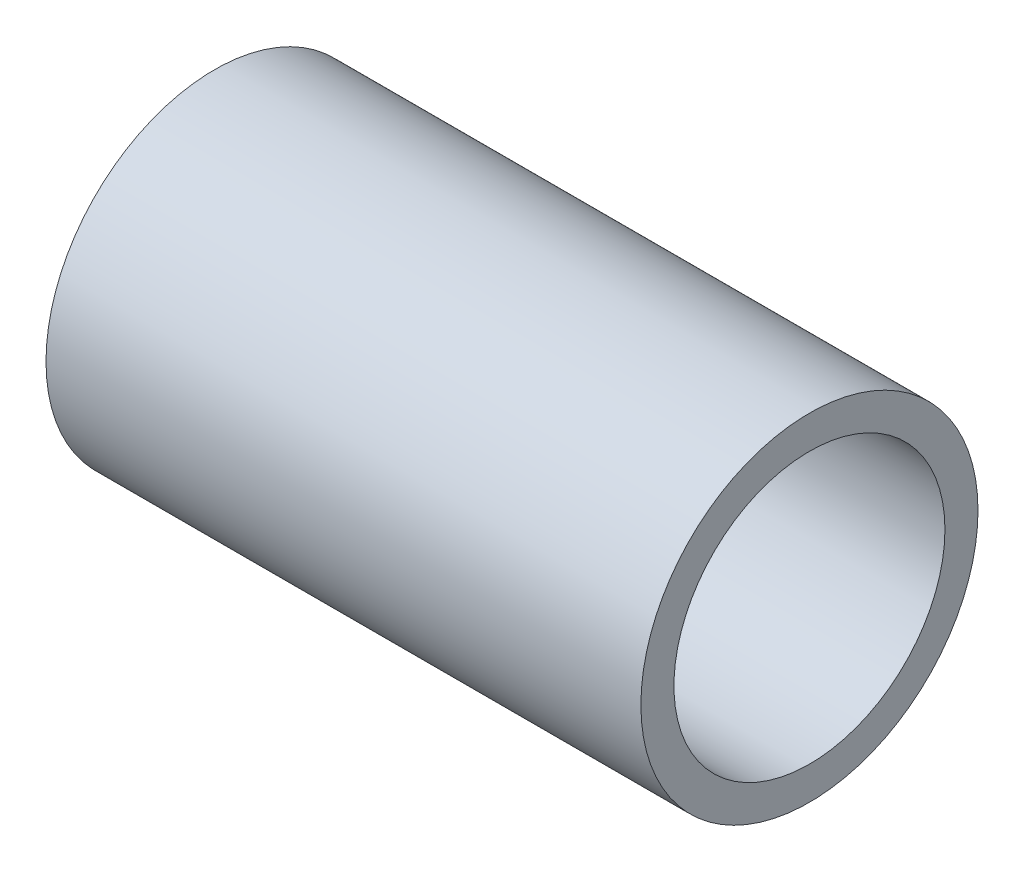
ISO-10303-21;
HEADER;
FILE_DESCRIPTION(('STEP AP214'),'2;1');
FILE_NAME('part.step','',(''),(''),'','','');
FILE_SCHEMA(('AUTOMOTIVE_DESIGN { 1 0 10303 214 1 1 1 1 }'));
ENDSEC;
DATA;
#1=APPLICATION_CONTEXT('core data for automotive mechanical design processes');
#2=APPLICATION_PROTOCOL_DEFINITION('international standard','automotive_design',2000,#1);
#3=PRODUCT_CONTEXT('',#1,'mechanical');
#4=PRODUCT('Part','Part','',(#3));
#5=PRODUCT_RELATED_PRODUCT_CATEGORY('part','',(#4));
#6=PRODUCT_DEFINITION_FORMATION('','',#4);
#7=PRODUCT_DEFINITION_CONTEXT('part definition',#1,'design');
#8=PRODUCT_DEFINITION('design','',#6,#7);
#9=PRODUCT_DEFINITION_SHAPE('','',#8);
#10=(LENGTH_UNIT() NAMED_UNIT(*) SI_UNIT(.MILLI.,.METRE.));
#11=(NAMED_UNIT(*) PLANE_ANGLE_UNIT() SI_UNIT($,.RADIAN.));
#12=(NAMED_UNIT(*) SI_UNIT($,.STERADIAN.) SOLID_ANGLE_UNIT());
#13=UNCERTAINTY_MEASURE_WITH_UNIT(LENGTH_MEASURE(1.E-05),#10,'distance_accuracy_value','');
#14=(GEOMETRIC_REPRESENTATION_CONTEXT(3) GLOBAL_UNCERTAINTY_ASSIGNED_CONTEXT((#13)) GLOBAL_UNIT_ASSIGNED_CONTEXT((#10,
#11,#12)) REPRESENTATION_CONTEXT('',''));
#15=CARTESIAN_POINT('',(0.,0.,0.));
#16=DIRECTION('',(0.,0.,1.));
#17=DIRECTION('',(1.,0.,0.));
#18=AXIS2_PLACEMENT_3D('',#15,#16,#17);
#19=CARTESIAN_POINT('',(9.,0.,0.));
#20=DIRECTION('',(1.,0.,0.));
#21=DIRECTION('',(0.,0.,-1.));
#22=AXIS2_PLACEMENT_3D('',#19,#20,#21);
#23=PLANE('',#22);
#24=CARTESIAN_POINT('',(9.,0.,0.));
#25=DIRECTION('',(1.,0.,0.));
#26=DIRECTION('',(0.,0.,-1.));
#27=AXIS2_PLACEMENT_3D('',#24,#25,#26);
#28=CIRCLE('',#27,2.55);
#29=CARTESIAN_POINT('',(9.,0.,-2.55));
#30=VERTEX_POINT('',#29);
#31=EDGE_CURVE('E10',#30,#30,#28,.T.);
#32=ORIENTED_EDGE('',*,*,#31,.T.);
#33=EDGE_LOOP('',(#32));
#34=FACE_BOUND('',#33,.T.);
#35=CARTESIAN_POINT('',(9.,0.,0.));
#36=DIRECTION('',(1.,0.,0.));
#37=DIRECTION('',(0.,0.,-1.));
#38=AXIS2_PLACEMENT_3D('',#35,#36,#37);
#39=CIRCLE('',#38,2.05);
#40=CARTESIAN_POINT('',(9.,0.,-2.05));
#41=VERTEX_POINT('',#40);
#42=EDGE_CURVE('E50',#41,#41,#39,.T.);
#43=ORIENTED_EDGE('',*,*,#42,.F.);
#44=EDGE_LOOP('',(#43));
#45=FACE_BOUND('',#44,.T.);
#46=ADVANCED_FACE('F39',(#34,#45),#23,.T.);
#47=CARTESIAN_POINT('',(0.,0.,0.));
#48=DIRECTION('',(1.,0.,0.));
#49=DIRECTION('',(0.,0.,-1.));
#50=AXIS2_PLACEMENT_3D('',#47,#48,#49);
#51=PLANE('',#50);
#52=CARTESIAN_POINT('',(0.,0.,0.));
#53=DIRECTION('',(1.,0.,0.));
#54=DIRECTION('',(0.,0.,-1.));
#55=AXIS2_PLACEMENT_3D('',#52,#53,#54);
#56=CIRCLE('',#55,2.55);
#57=CARTESIAN_POINT('',(0.,0.,-2.55));
#58=VERTEX_POINT('',#57);
#59=EDGE_CURVE('E43',#58,#58,#56,.T.);
#60=ORIENTED_EDGE('',*,*,#59,.F.);
#61=EDGE_LOOP('',(#60));
#62=FACE_BOUND('',#61,.T.);
#63=CARTESIAN_POINT('',(0.,0.,0.));
#64=DIRECTION('',(1.,0.,0.));
#65=DIRECTION('',(0.,0.,-1.));
#66=AXIS2_PLACEMENT_3D('',#63,#64,#65);
#67=CIRCLE('',#66,2.05);
#68=CARTESIAN_POINT('',(0.,0.,-2.05));
#69=VERTEX_POINT('',#68);
#70=EDGE_CURVE('E52',#69,#69,#67,.T.);
#71=ORIENTED_EDGE('',*,*,#70,.T.);
#72=EDGE_LOOP('',(#71));
#73=FACE_BOUND('',#72,.T.);
#74=ADVANCED_FACE('F62',(#62,#73),#51,.F.);
#75=CARTESIAN_POINT('',(9.,0.,0.));
#76=DIRECTION('',(-1.,0.,0.));
#77=DIRECTION('',(0.,0.,1.));
#78=AXIS2_PLACEMENT_3D('',#75,#76,#77);
#79=CYLINDRICAL_SURFACE('',#78,2.55);
#80=ORIENTED_EDGE('',*,*,#31,.F.);
#81=EDGE_LOOP('',(#80));
#82=FACE_BOUND('',#81,.T.);
#83=ORIENTED_EDGE('',*,*,#59,.T.);
#84=EDGE_LOOP('',(#83));
#85=FACE_BOUND('',#84,.T.);
#86=ADVANCED_FACE('F41',(#82,#85),#79,.T.);
#87=CARTESIAN_POINT('',(9.,0.,0.));
#88=DIRECTION('',(-1.,0.,0.));
#89=DIRECTION('',(0.,0.,1.));
#90=AXIS2_PLACEMENT_3D('',#87,#88,#89);
#91=CYLINDRICAL_SURFACE('',#90,2.05);
#92=ORIENTED_EDGE('',*,*,#42,.T.);
#93=EDGE_LOOP('',(#92));
#94=FACE_BOUND('',#93,.T.);
#95=ORIENTED_EDGE('',*,*,#70,.F.);
#96=EDGE_LOOP('',(#95));
#97=FACE_BOUND('',#96,.T.);
#98=ADVANCED_FACE('F58',(#94,#97),#91,.F.);
#99=CLOSED_SHELL('',(#46,#74,#86,#98));
#100=MANIFOLD_SOLID_BREP('B2',#99);
#101=ADVANCED_BREP_SHAPE_REPRESENTATION('',(#18,#100),#14);
#102=SHAPE_DEFINITION_REPRESENTATION(#9,#101);
ENDSEC;
END-ISO-10303-21;
